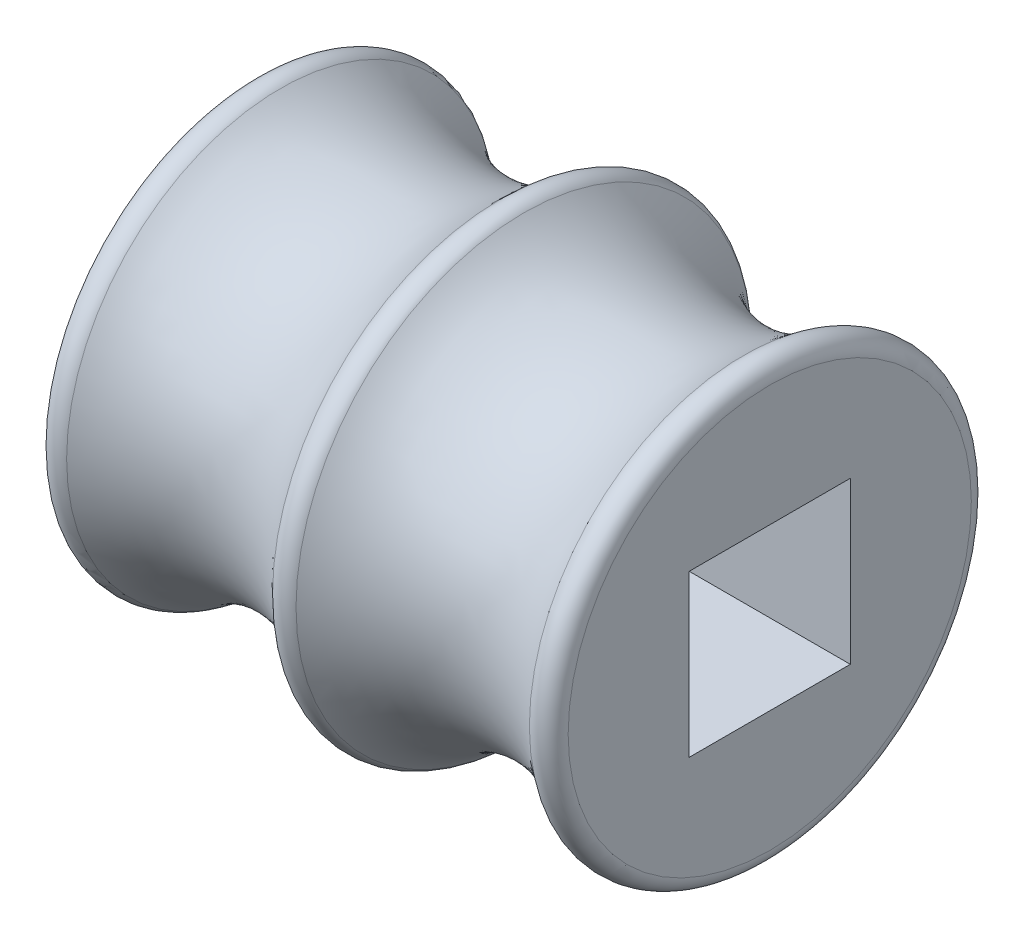
ISO-10303-21;
HEADER;
FILE_DESCRIPTION(('STEP AP214'),'2;1');
FILE_NAME('part.step','',(''),(''),'','','');
FILE_SCHEMA(('AUTOMOTIVE_DESIGN { 1 0 10303 214 1 1 1 1 }'));
ENDSEC;
DATA;
#1=APPLICATION_CONTEXT('core data for automotive mechanical design processes');
#2=APPLICATION_PROTOCOL_DEFINITION('international standard','automotive_design',2000,#1);
#3=PRODUCT_CONTEXT('',#1,'mechanical');
#4=PRODUCT('Part','Part','',(#3));
#5=PRODUCT_RELATED_PRODUCT_CATEGORY('part','',(#4));
#6=PRODUCT_DEFINITION_FORMATION('','',#4);
#7=PRODUCT_DEFINITION_CONTEXT('part definition',#1,'design');
#8=PRODUCT_DEFINITION('design','',#6,#7);
#9=PRODUCT_DEFINITION_SHAPE('','',#8);
#10=(LENGTH_UNIT() NAMED_UNIT(*) SI_UNIT(.MILLI.,.METRE.));
#11=(NAMED_UNIT(*) PLANE_ANGLE_UNIT() SI_UNIT($,.RADIAN.));
#12=(NAMED_UNIT(*) SI_UNIT($,.STERADIAN.) SOLID_ANGLE_UNIT());
#13=UNCERTAINTY_MEASURE_WITH_UNIT(LENGTH_MEASURE(1.E-05),#10,'distance_accuracy_value','');
#14=(GEOMETRIC_REPRESENTATION_CONTEXT(3) GLOBAL_UNCERTAINTY_ASSIGNED_CONTEXT((#13)) GLOBAL_UNIT_ASSIGNED_CONTEXT((#10,
#11,#12)) REPRESENTATION_CONTEXT('',''));
#15=CARTESIAN_POINT('',(0.,0.,0.));
#16=DIRECTION('',(0.,0.,1.));
#17=DIRECTION('',(1.,0.,0.));
#18=AXIS2_PLACEMENT_3D('',#15,#16,#17);
#19=CARTESIAN_POINT('',(-10.16,2.286,0.));
#20=DIRECTION('',(1.,0.,0.));
#21=DIRECTION('',(0.,0.,1.));
#22=AXIS2_PLACEMENT_3D('',#19,#20,#21);
#23=PLANE('',#22);
#24=CARTESIAN_POINT('',(-10.16,0.,0.));
#25=DIRECTION('',(1.,0.,0.));
#26=DIRECTION('',(0.,0.,-1.));
#27=AXIS2_PLACEMENT_3D('',#24,#25,#26);
#28=CIRCLE('',#27,7.94684632735851);
#29=CARTESIAN_POINT('',(-10.16,0.,-7.94684632735851));
#30=VERTEX_POINT('',#29);
#31=EDGE_CURVE('E143',#30,#30,#28,.F.);
#32=ORIENTED_EDGE('',*,*,#31,.T.);
#33=EDGE_LOOP('',(#32));
#34=FACE_BOUND('',#33,.T.);
#35=DIRECTION('',(0.,-1.,0.));
#36=VECTOR('',#35,1.);
#37=CARTESIAN_POINT('',(-10.16,-3.175,3.175));
#38=LINE('',#37,#36);
#39=CARTESIAN_POINT('',(-10.16,3.175,3.175));
#40=VERTEX_POINT('',#39);
#41=CARTESIAN_POINT('',(-10.16,-3.175,3.175));
#42=VERTEX_POINT('',#41);
#43=EDGE_CURVE('E103',#40,#42,#38,.T.);
#44=ORIENTED_EDGE('',*,*,#43,.T.);
#45=DIRECTION('',(0.,0.,-1.));
#46=VECTOR('',#45,1.);
#47=CARTESIAN_POINT('',(-10.16,-3.175,-3.175));
#48=LINE('',#47,#46);
#49=CARTESIAN_POINT('',(-10.16,-3.175,-3.175));
#50=VERTEX_POINT('',#49);
#51=EDGE_CURVE('E106',#42,#50,#48,.T.);
#52=ORIENTED_EDGE('',*,*,#51,.T.);
#53=DIRECTION('',(0.,1.,0.));
#54=VECTOR('',#53,1.);
#55=CARTESIAN_POINT('',(-10.16,-3.175,-3.175));
#56=LINE('',#55,#54);
#57=CARTESIAN_POINT('',(-10.16,3.175,-3.175));
#58=VERTEX_POINT('',#57);
#59=EDGE_CURVE('E89',#50,#58,#56,.T.);
#60=ORIENTED_EDGE('',*,*,#59,.T.);
#61=DIRECTION('',(0.,0.,1.));
#62=VECTOR('',#61,1.);
#63=CARTESIAN_POINT('',(-10.16,3.175,-3.175));
#64=LINE('',#63,#62);
#65=EDGE_CURVE('E98',#58,#40,#64,.T.);
#66=ORIENTED_EDGE('',*,*,#65,.T.);
#67=EDGE_LOOP('',(#44,#52,#60,#66));
#68=FACE_BOUND('',#67,.T.);
#69=ADVANCED_FACE('F43',(#34,#68),#23,.F.);
#70=CARTESIAN_POINT('',(10.16,2.286,0.));
#71=DIRECTION('',(-1.,0.,0.));
#72=DIRECTION('',(0.,0.,1.));
#73=AXIS2_PLACEMENT_3D('',#70,#71,#72);
#74=PLANE('',#73);
#75=CARTESIAN_POINT('',(10.16,0.,0.));
#76=DIRECTION('',(-1.,0.,0.));
#77=DIRECTION('',(0.,0.,1.));
#78=AXIS2_PLACEMENT_3D('',#75,#76,#77);
#79=CIRCLE('',#78,7.94684632735851);
#80=CARTESIAN_POINT('',(10.16,0.,7.94684632735851));
#81=VERTEX_POINT('',#80);
#82=EDGE_CURVE('E139',#81,#81,#79,.F.);
#83=ORIENTED_EDGE('',*,*,#82,.T.);
#84=EDGE_LOOP('',(#83));
#85=FACE_BOUND('',#84,.T.);
#86=DIRECTION('',(0.,0.,-1.));
#87=VECTOR('',#86,1.);
#88=CARTESIAN_POINT('',(10.16,-3.175,-3.175));
#89=LINE('',#88,#87);
#90=CARTESIAN_POINT('',(10.16,-3.175,3.175));
#91=VERTEX_POINT('',#90);
#92=CARTESIAN_POINT('',(10.16,-3.175,-3.175));
#93=VERTEX_POINT('',#92);
#94=EDGE_CURVE('E115',#91,#93,#89,.T.);
#95=ORIENTED_EDGE('',*,*,#94,.F.);
#96=DIRECTION('',(0.,-1.,0.));
#97=VECTOR('',#96,1.);
#98=CARTESIAN_POINT('',(10.16,-3.175,3.175));
#99=LINE('',#98,#97);
#100=CARTESIAN_POINT('',(10.16,3.175,3.175));
#101=VERTEX_POINT('',#100);
#102=EDGE_CURVE('E66',#101,#91,#99,.T.);
#103=ORIENTED_EDGE('',*,*,#102,.F.);
#104=DIRECTION('',(0.,0.,1.));
#105=VECTOR('',#104,1.);
#106=CARTESIAN_POINT('',(10.16,3.175,-3.175));
#107=LINE('',#106,#105);
#108=CARTESIAN_POINT('',(10.16,3.175,-3.175));
#109=VERTEX_POINT('',#108);
#110=EDGE_CURVE('E121',#109,#101,#107,.T.);
#111=ORIENTED_EDGE('',*,*,#110,.F.);
#112=DIRECTION('',(0.,1.,0.));
#113=VECTOR('',#112,1.);
#114=CARTESIAN_POINT('',(10.16,-3.175,-3.175));
#115=LINE('',#114,#113);
#116=EDGE_CURVE('E92',#93,#109,#115,.T.);
#117=ORIENTED_EDGE('',*,*,#116,.F.);
#118=EDGE_LOOP('',(#95,#103,#111,#117));
#119=FACE_BOUND('',#118,.T.);
#120=ADVANCED_FACE('F162',(#85,#119),#74,.F.);
#121=CARTESIAN_POINT('',(5.08,0.,0.));
#122=DIRECTION('',(-1.,0.,0.));
#123=DIRECTION('',(0.,0.,1.));
#124=AXIS2_PLACEMENT_3D('',#121,#122,#123);
#125=TOROIDAL_SURFACE('',#124,13.335,6.35);
#126=CARTESIAN_POINT('',(9.12090909090909,0.,0.));
#127=DIRECTION('',(-1.,0.,0.));
#128=DIRECTION('',(0.,0.,1.));
#129=AXIS2_PLACEMENT_3D('',#126,#127,#128);
#130=CIRCLE('',#129,8.43667847941683);
#131=CARTESIAN_POINT('',(9.12090909090909,0.,8.43667847941683));
#132=VERTEX_POINT('',#131);
#133=EDGE_CURVE('E135',#132,#132,#130,.T.);
#134=ORIENTED_EDGE('',*,*,#133,.T.);
#135=EDGE_LOOP('',(#134));
#136=FACE_BOUND('',#135,.T.);
#137=CARTESIAN_POINT('',(0.461818181818184,0.,0.));
#138=DIRECTION('',(1.,0.,0.));
#139=DIRECTION('',(0.,0.,-1.));
#140=AXIS2_PLACEMENT_3D('',#137,#138,#139);
#141=CIRCLE('',#140,8.9766864850937);
#142=CARTESIAN_POINT('',(0.461818181818184,0.,-8.9766864850937));
#143=VERTEX_POINT('',#142);
#144=EDGE_CURVE('E126',#143,#143,#141,.T.);
#145=ORIENTED_EDGE('',*,*,#144,.T.);
#146=EDGE_LOOP('',(#145));
#147=FACE_BOUND('',#146,.T.);
#148=ADVANCED_FACE('F168',(#136,#147),#125,.F.);
#149=CARTESIAN_POINT('',(0.,-3.175,3.175));
#150=DIRECTION('',(0.,0.,1.));
#151=DIRECTION('',(0.,-1.,0.));
#152=AXIS2_PLACEMENT_3D('',#149,#150,#151);
#153=PLANE('',#152);
#154=ORIENTED_EDGE('',*,*,#102,.T.);
#155=DIRECTION('',(1.,0.,0.));
#156=VECTOR('',#155,1.);
#157=CARTESIAN_POINT('',(0.,-3.175,3.175));
#158=LINE('',#157,#156);
#159=EDGE_CURVE('E124',#42,#91,#158,.T.);
#160=ORIENTED_EDGE('',*,*,#159,.F.);
#161=ORIENTED_EDGE('',*,*,#43,.F.);
#162=DIRECTION('',(1.,0.,0.));
#163=VECTOR('',#162,1.);
#164=CARTESIAN_POINT('',(0.,3.175,3.175));
#165=LINE('',#164,#163);
#166=EDGE_CURVE('E59',#40,#101,#165,.T.);
#167=ORIENTED_EDGE('',*,*,#166,.T.);
#168=EDGE_LOOP('',(#154,#160,#161,#167));
#169=FACE_BOUND('',#168,.T.);
#170=ADVANCED_FACE('F175',(#169),#153,.F.);
#171=CARTESIAN_POINT('',(0.,3.175,-3.175));
#172=DIRECTION('',(0.,1.,0.));
#173=DIRECTION('',(0.,0.,1.));
#174=AXIS2_PLACEMENT_3D('',#171,#172,#173);
#175=PLANE('',#174);
#176=ORIENTED_EDGE('',*,*,#110,.T.);
#177=ORIENTED_EDGE('',*,*,#166,.F.);
#178=ORIENTED_EDGE('',*,*,#65,.F.);
#179=DIRECTION('',(1.,0.,0.));
#180=VECTOR('',#179,1.);
#181=CARTESIAN_POINT('',(0.,3.175,-3.175));
#182=LINE('',#181,#180);
#183=EDGE_CURVE('E86',#58,#109,#182,.T.);
#184=ORIENTED_EDGE('',*,*,#183,.T.);
#185=EDGE_LOOP('',(#176,#177,#178,#184));
#186=FACE_BOUND('',#185,.T.);
#187=ADVANCED_FACE('F99',(#186),#175,.F.);
#188=CARTESIAN_POINT('',(0.,-3.175,-3.175));
#189=DIRECTION('',(0.,0.,-1.));
#190=DIRECTION('',(-1.,0.,0.));
#191=AXIS2_PLACEMENT_3D('',#188,#189,#190);
#192=PLANE('',#191);
#193=ORIENTED_EDGE('',*,*,#116,.T.);
#194=ORIENTED_EDGE('',*,*,#183,.F.);
#195=ORIENTED_EDGE('',*,*,#59,.F.);
#196=DIRECTION('',(1.,0.,0.));
#197=VECTOR('',#196,1.);
#198=CARTESIAN_POINT('',(0.,-3.175,-3.175));
#199=LINE('',#198,#197);
#200=EDGE_CURVE('E95',#50,#93,#199,.T.);
#201=ORIENTED_EDGE('',*,*,#200,.T.);
#202=EDGE_LOOP('',(#193,#194,#195,#201));
#203=FACE_BOUND('',#202,.T.);
#204=ADVANCED_FACE('F87',(#203),#192,.F.);
#205=CARTESIAN_POINT('',(0.,-3.175,-3.175));
#206=DIRECTION('',(0.,-1.,0.));
#207=DIRECTION('',(0.,0.,-1.));
#208=AXIS2_PLACEMENT_3D('',#205,#206,#207);
#209=PLANE('',#208);
#210=ORIENTED_EDGE('',*,*,#94,.T.);
#211=ORIENTED_EDGE('',*,*,#200,.F.);
#212=ORIENTED_EDGE('',*,*,#51,.F.);
#213=ORIENTED_EDGE('',*,*,#159,.T.);
#214=EDGE_LOOP('',(#210,#211,#212,#213));
#215=FACE_BOUND('',#214,.T.);
#216=ADVANCED_FACE('F178',(#215),#209,.F.);
#217=CARTESIAN_POINT('',(-5.08,0.,0.));
#218=DIRECTION('',(1.,0.,0.));
#219=DIRECTION('',(0.,0.,1.));
#220=AXIS2_PLACEMENT_3D('',#217,#218,#219);
#221=TOROIDAL_SURFACE('',#220,13.335,6.35);
#222=CARTESIAN_POINT('',(-9.12090909090909,0.,0.));
#223=DIRECTION('',(1.,0.,0.));
#224=DIRECTION('',(0.,0.,-1.));
#225=AXIS2_PLACEMENT_3D('',#222,#223,#224);
#226=CIRCLE('',#225,8.43667847941683);
#227=CARTESIAN_POINT('',(-9.12090909090909,0.,-8.43667847941683));
#228=VERTEX_POINT('',#227);
#229=EDGE_CURVE('E11',#228,#228,#226,.T.);
#230=ORIENTED_EDGE('',*,*,#229,.T.);
#231=EDGE_LOOP('',(#230));
#232=FACE_BOUND('',#231,.T.);
#233=CARTESIAN_POINT('',(-0.461818181818184,0.,0.));
#234=DIRECTION('',(-1.,0.,0.));
#235=DIRECTION('',(0.,0.,1.));
#236=AXIS2_PLACEMENT_3D('',#233,#234,#235);
#237=CIRCLE('',#236,8.9766864850937);
#238=CARTESIAN_POINT('',(-0.461818181818184,0.,8.9766864850937));
#239=VERTEX_POINT('',#238);
#240=EDGE_CURVE('E52',#239,#239,#237,.T.);
#241=ORIENTED_EDGE('',*,*,#240,.T.);
#242=EDGE_LOOP('',(#241));
#243=FACE_BOUND('',#242,.T.);
#244=ADVANCED_FACE('F150',(#232,#243),#221,.F.);
#245=CARTESIAN_POINT('',(9.525,0.,0.));
#246=DIRECTION('',(1.,0.,0.));
#247=DIRECTION('',(0.,0.,-1.));
#248=AXIS2_PLACEMENT_3D('',#245,#246,#247);
#249=TOROIDAL_SURFACE('',#248,7.94684632735851,0.635);
#250=ORIENTED_EDGE('',*,*,#82,.F.);
#251=EDGE_LOOP('',(#250));
#252=FACE_BOUND('',#251,.T.);
#253=ORIENTED_EDGE('',*,*,#133,.F.);
#254=EDGE_LOOP('',(#253));
#255=FACE_BOUND('',#254,.T.);
#256=ADVANCED_FACE('F158',(#252,#255),#249,.T.);
#257=CARTESIAN_POINT('',(-9.525,0.,0.));
#258=DIRECTION('',(-1.,0.,0.));
#259=DIRECTION('',(0.,0.,1.));
#260=AXIS2_PLACEMENT_3D('',#257,#258,#259);
#261=TOROIDAL_SURFACE('',#260,7.94684632735851,0.635);
#262=ORIENTED_EDGE('',*,*,#229,.F.);
#263=EDGE_LOOP('',(#262));
#264=FACE_BOUND('',#263,.T.);
#265=ORIENTED_EDGE('',*,*,#31,.F.);
#266=EDGE_LOOP('',(#265));
#267=FACE_BOUND('',#266,.T.);
#268=ADVANCED_FACE('F153',(#264,#267),#261,.T.);
#269=CARTESIAN_POINT('',(0.,0.,0.));
#270=DIRECTION('',(1.,0.,0.));
#271=DIRECTION('',(0.,0.,-1.));
#272=AXIS2_PLACEMENT_3D('',#269,#270,#271);
#273=TOROIDAL_SURFACE('',#272,8.54085513360307,0.635);
#274=ORIENTED_EDGE('',*,*,#144,.F.);
#275=EDGE_LOOP('',(#274));
#276=FACE_BOUND('',#275,.T.);
#277=ORIENTED_EDGE('',*,*,#240,.F.);
#278=EDGE_LOOP('',(#277));
#279=FACE_BOUND('',#278,.T.);
#280=ADVANCED_FACE('F45',(#276,#279),#273,.T.);
#281=CLOSED_SHELL('',(#69,#120,#148,#170,#187,#204,#216,#244,#256,#268,#280));
#282=MANIFOLD_SOLID_BREP('B2',#281);
#283=ADVANCED_BREP_SHAPE_REPRESENTATION('',(#18,#282),#14);
#284=SHAPE_DEFINITION_REPRESENTATION(#9,#283);
ENDSEC;
END-ISO-10303-21;
